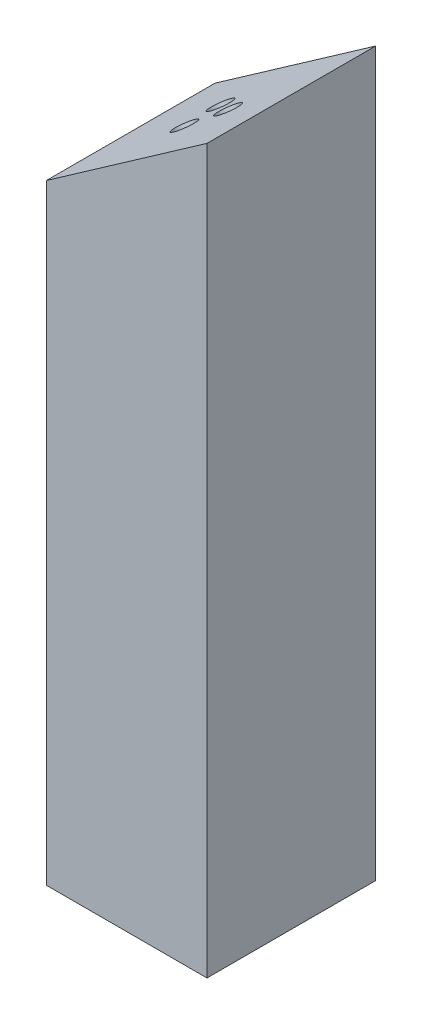
ISO-10303-21;
HEADER;
FILE_DESCRIPTION(('STEP AP214'),'2;1');
FILE_NAME('part.step','',(''),(''),'','','');
FILE_SCHEMA(('AUTOMOTIVE_DESIGN { 1 0 10303 214 1 1 1 1 }'));
ENDSEC;
DATA;
#1=APPLICATION_CONTEXT('core data for automotive mechanical design processes');
#2=APPLICATION_PROTOCOL_DEFINITION('international standard','automotive_design',2000,#1);
#3=PRODUCT_CONTEXT('',#1,'mechanical');
#4=PRODUCT('Part','Part','',(#3));
#5=PRODUCT_RELATED_PRODUCT_CATEGORY('part','',(#4));
#6=PRODUCT_DEFINITION_FORMATION('','',#4);
#7=PRODUCT_DEFINITION_CONTEXT('part definition',#1,'design');
#8=PRODUCT_DEFINITION('design','',#6,#7);
#9=PRODUCT_DEFINITION_SHAPE('','',#8);
#10=(LENGTH_UNIT() NAMED_UNIT(*) SI_UNIT(.MILLI.,.METRE.));
#11=(NAMED_UNIT(*) PLANE_ANGLE_UNIT() SI_UNIT($,.RADIAN.));
#12=(NAMED_UNIT(*) SI_UNIT($,.STERADIAN.) SOLID_ANGLE_UNIT());
#13=UNCERTAINTY_MEASURE_WITH_UNIT(LENGTH_MEASURE(1.E-05),#10,'distance_accuracy_value','');
#14=(GEOMETRIC_REPRESENTATION_CONTEXT(3) GLOBAL_UNCERTAINTY_ASSIGNED_CONTEXT((#13)) GLOBAL_UNIT_ASSIGNED_CONTEXT((#10,
#11,#12)) REPRESENTATION_CONTEXT('',''));
#15=CARTESIAN_POINT('',(0.,0.,0.));
#16=DIRECTION('',(0.,0.,1.));
#17=DIRECTION('',(1.,0.,0.));
#18=AXIS2_PLACEMENT_3D('',#15,#16,#17);
#19=CARTESIAN_POINT('',(-50.,350.,-52.5));
#20=DIRECTION('',(1.,0.,0.));
#21=DIRECTION('',(0.,0.,-1.));
#22=AXIS2_PLACEMENT_3D('',#19,#20,#21);
#23=PLANE('',#22);
#24=CARTESIAN_POINT('',(-50.,361.97924617903,-27.));
#25=DIRECTION('',(1.,0.,0.));
#26=DIRECTION('',(0.,0.,-1.));
#27=AXIS2_PLACEMENT_3D('',#24,#25,#26);
#28=CIRCLE('',#27,8.);
#29=CARTESIAN_POINT('',(-50.,353.97924617903,-27.));
#30=VERTEX_POINT('',#29);
#31=CARTESIAN_POINT('',(-50.,361.97924617903,-35.));
#32=VERTEX_POINT('',#31);
#33=EDGE_CURVE('E59',#30,#32,#28,.T.);
#34=ORIENTED_EDGE('',*,*,#33,.T.);
#35=CARTESIAN_POINT('',(-50.,361.97924617903,-27.));
#36=DIRECTION('',(1.,0.,0.));
#37=DIRECTION('',(0.,0.,-1.));
#38=AXIS2_PLACEMENT_3D('',#35,#36,#37);
#39=CIRCLE('',#38,8.);
#40=CARTESIAN_POINT('',(-50.,369.97924617903,-27.));
#41=VERTEX_POINT('',#40);
#42=EDGE_CURVE('E45',#32,#41,#39,.T.);
#43=ORIENTED_EDGE('',*,*,#42,.T.);
#44=DIRECTION('',(0.,0.,-1.));
#45=VECTOR('',#44,1.);
#46=CARTESIAN_POINT('',(-50.,369.97924617903,-35.));
#47=LINE('',#46,#45);
#48=CARTESIAN_POINT('',(-50.,369.97924617903,27.));
#49=VERTEX_POINT('',#48);
#50=EDGE_CURVE('E251',#49,#41,#47,.T.);
#51=ORIENTED_EDGE('',*,*,#50,.F.);
#52=CARTESIAN_POINT('',(-50.,361.97924617903,27.));
#53=DIRECTION('',(1.,0.,0.));
#54=DIRECTION('',(0.,0.,-1.));
#55=AXIS2_PLACEMENT_3D('',#52,#53,#54);
#56=CIRCLE('',#55,8.);
#57=CARTESIAN_POINT('',(-50.,361.97924617903,35.));
#58=VERTEX_POINT('',#57);
#59=EDGE_CURVE('E226',#49,#58,#56,.T.);
#60=ORIENTED_EDGE('',*,*,#59,.T.);
#61=CARTESIAN_POINT('',(-50.,361.97924617903,27.));
#62=DIRECTION('',(1.,0.,0.));
#63=DIRECTION('',(0.,0.,-1.));
#64=AXIS2_PLACEMENT_3D('',#61,#62,#63);
#65=CIRCLE('',#64,8.);
#66=CARTESIAN_POINT('',(-50.,353.97924617903,27.));
#67=VERTEX_POINT('',#66);
#68=EDGE_CURVE('E222',#58,#67,#65,.T.);
#69=ORIENTED_EDGE('',*,*,#68,.T.);
#70=DIRECTION('',(0.,0.,1.));
#71=VECTOR('',#70,1.);
#72=CARTESIAN_POINT('',(-50.,353.97924617903,-35.));
#73=LINE('',#72,#71);
#74=EDGE_CURVE('E257',#30,#67,#73,.T.);
#75=ORIENTED_EDGE('',*,*,#74,.F.);
#76=EDGE_LOOP('',(#34,#43,#51,#60,#69,#75));
#77=FACE_BOUND('',#76,.T.);
#78=DIRECTION('',(0.,-1.,0.));
#79=VECTOR('',#78,1.);
#80=CARTESIAN_POINT('',(-50.,350.,52.5));
#81=LINE('',#80,#79);
#82=CARTESIAN_POINT('',(-50.,379.97924617903,52.5));
#83=VERTEX_POINT('',#82);
#84=CARTESIAN_POINT('',(-50.,0.,52.5));
#85=VERTEX_POINT('',#84);
#86=EDGE_CURVE('E210',#83,#85,#81,.T.);
#87=ORIENTED_EDGE('',*,*,#86,.F.);
#88=DIRECTION('',(0.,0.,1.));
#89=VECTOR('',#88,1.);
#90=CARTESIAN_POINT('',(-50.,379.97924617903,-52.501));
#91=LINE('',#90,#89);
#92=CARTESIAN_POINT('',(-50.,379.97924617903,-52.5));
#93=VERTEX_POINT('',#92);
#94=EDGE_CURVE('E166',#93,#83,#91,.T.);
#95=ORIENTED_EDGE('',*,*,#94,.F.);
#96=DIRECTION('',(0.,-1.,0.));
#97=VECTOR('',#96,1.);
#98=CARTESIAN_POINT('',(-50.,350.,-52.5));
#99=LINE('',#98,#97);
#100=CARTESIAN_POINT('',(-50.,0.,-52.5));
#101=VERTEX_POINT('',#100);
#102=EDGE_CURVE('E202',#93,#101,#99,.T.);
#103=ORIENTED_EDGE('',*,*,#102,.T.);
#104=DIRECTION('',(0.,0.,1.));
#105=VECTOR('',#104,1.);
#106=CARTESIAN_POINT('',(-50.,0.,-52.5));
#107=LINE('',#106,#105);
#108=EDGE_CURVE('E192',#101,#85,#107,.T.);
#109=ORIENTED_EDGE('',*,*,#108,.T.);
#110=EDGE_LOOP('',(#87,#95,#103,#109));
#111=FACE_BOUND('',#110,.T.);
#112=ADVANCED_FACE('F36',(#77,#111),#23,.F.);
#113=CARTESIAN_POINT('',(-50.,350.,52.5));
#114=DIRECTION('',(0.,0.,-1.));
#115=DIRECTION('',(-1.,0.,0.));
#116=AXIS2_PLACEMENT_3D('',#113,#114,#115);
#117=PLANE('',#116);
#118=DIRECTION('',(0.,-1.,0.));
#119=VECTOR('',#118,1.);
#120=CARTESIAN_POINT('',(50.,350.,52.5));
#121=LINE('',#120,#119);
#122=CARTESIAN_POINT('',(50.,450.,52.5));
#123=VERTEX_POINT('',#122);
#124=CARTESIAN_POINT('',(50.,0.,52.5));
#125=VERTEX_POINT('',#124);
#126=EDGE_CURVE('E207',#123,#125,#121,.T.);
#127=ORIENTED_EDGE('',*,*,#126,.F.);
#128=DIRECTION('',(0.819152044288995,0.573576436351042,0.));
#129=VECTOR('',#128,1.);
#130=CARTESIAN_POINT('',(50.,450.,52.5));
#131=LINE('',#130,#129);
#132=EDGE_CURVE('E163',#83,#123,#131,.T.);
#133=ORIENTED_EDGE('',*,*,#132,.F.);
#134=ORIENTED_EDGE('',*,*,#86,.T.);
#135=DIRECTION('',(1.,0.,0.));
#136=VECTOR('',#135,1.);
#137=CARTESIAN_POINT('',(-50.,0.,52.5));
#138=LINE('',#137,#136);
#139=EDGE_CURVE('E195',#85,#125,#138,.T.);
#140=ORIENTED_EDGE('',*,*,#139,.T.);
#141=EDGE_LOOP('',(#127,#133,#134,#140));
#142=FACE_BOUND('',#141,.T.);
#143=ADVANCED_FACE('F302',(#142),#117,.F.);
#144=CARTESIAN_POINT('',(50.,350.,-52.5));
#145=DIRECTION('',(-1.,0.,0.));
#146=DIRECTION('',(0.,0.,1.));
#147=AXIS2_PLACEMENT_3D('',#144,#145,#146);
#148=PLANE('',#147);
#149=DIRECTION('',(0.,0.,-1.));
#150=VECTOR('',#149,1.);
#151=CARTESIAN_POINT('',(50.,0.,-52.5));
#152=LINE('',#151,#150);
#153=CARTESIAN_POINT('',(50.,0.,-52.5));
#154=VERTEX_POINT('',#153);
#155=EDGE_CURVE('E197',#125,#154,#152,.T.);
#156=ORIENTED_EDGE('',*,*,#155,.T.);
#157=DIRECTION('',(0.,-1.,0.));
#158=VECTOR('',#157,1.);
#159=CARTESIAN_POINT('',(50.,350.,-52.5));
#160=LINE('',#159,#158);
#161=CARTESIAN_POINT('',(50.,450.,-52.5));
#162=VERTEX_POINT('',#161);
#163=EDGE_CURVE('E204',#162,#154,#160,.T.);
#164=ORIENTED_EDGE('',*,*,#163,.F.);
#165=DIRECTION('',(0.,0.,-1.));
#166=VECTOR('',#165,1.);
#167=CARTESIAN_POINT('',(50.,450.,-52.5));
#168=LINE('',#167,#166);
#169=EDGE_CURVE('E190',#123,#162,#168,.T.);
#170=ORIENTED_EDGE('',*,*,#169,.F.);
#171=ORIENTED_EDGE('',*,*,#126,.T.);
#172=EDGE_LOOP('',(#156,#164,#170,#171));
#173=FACE_BOUND('',#172,.T.);
#174=ADVANCED_FACE('F304',(#173),#148,.F.);
#175=CARTESIAN_POINT('',(-50.,350.,-52.5));
#176=DIRECTION('',(0.,0.,1.));
#177=DIRECTION('',(1.,0.,0.));
#178=AXIS2_PLACEMENT_3D('',#175,#176,#177);
#179=PLANE('',#178);
#180=ORIENTED_EDGE('',*,*,#102,.F.);
#181=DIRECTION('',(-0.819152044288995,-0.573576436351042,0.));
#182=VECTOR('',#181,1.);
#183=CARTESIAN_POINT('',(50.,450.,-52.5));
#184=LINE('',#183,#182);
#185=EDGE_CURVE('E188',#162,#93,#184,.T.);
#186=ORIENTED_EDGE('',*,*,#185,.F.);
#187=ORIENTED_EDGE('',*,*,#163,.T.);
#188=DIRECTION('',(-1.,0.,0.));
#189=VECTOR('',#188,1.);
#190=CARTESIAN_POINT('',(-50.,0.,-52.5));
#191=LINE('',#190,#189);
#192=EDGE_CURVE('E199',#154,#101,#191,.T.);
#193=ORIENTED_EDGE('',*,*,#192,.T.);
#194=EDGE_LOOP('',(#180,#186,#187,#193));
#195=FACE_BOUND('',#194,.T.);
#196=ADVANCED_FACE('F294',(#195),#179,.F.);
#197=CARTESIAN_POINT('',(0.,0.,0.));
#198=DIRECTION('',(0.,1.,0.));
#199=DIRECTION('',(0.,0.,1.));
#200=AXIS2_PLACEMENT_3D('',#197,#198,#199);
#201=PLANE('',#200);
#202=DIRECTION('',(-1.,0.,0.));
#203=VECTOR('',#202,1.);
#204=CARTESIAN_POINT('',(-50.,0.,-47.5));
#205=LINE('',#204,#203);
#206=CARTESIAN_POINT('',(45.,0.,-47.5));
#207=VERTEX_POINT('',#206);
#208=CARTESIAN_POINT('',(-45.,0.,-47.5));
#209=VERTEX_POINT('',#208);
#210=EDGE_CURVE('E174',#207,#209,#205,.T.);
#211=ORIENTED_EDGE('',*,*,#210,.T.);
#212=DIRECTION('',(0.,0.,1.));
#213=VECTOR('',#212,1.);
#214=CARTESIAN_POINT('',(-45.,0.,-52.5));
#215=LINE('',#214,#213);
#216=CARTESIAN_POINT('',(-45.,0.,47.5));
#217=VERTEX_POINT('',#216);
#218=EDGE_CURVE('E178',#209,#217,#215,.T.);
#219=ORIENTED_EDGE('',*,*,#218,.T.);
#220=DIRECTION('',(1.,0.,0.));
#221=VECTOR('',#220,1.);
#222=CARTESIAN_POINT('',(-50.,0.,47.5));
#223=LINE('',#222,#221);
#224=CARTESIAN_POINT('',(45.,0.,47.5));
#225=VERTEX_POINT('',#224);
#226=EDGE_CURVE('E161',#217,#225,#223,.T.);
#227=ORIENTED_EDGE('',*,*,#226,.T.);
#228=DIRECTION('',(0.,0.,-1.));
#229=VECTOR('',#228,1.);
#230=CARTESIAN_POINT('',(45.,0.,-52.5));
#231=LINE('',#230,#229);
#232=EDGE_CURVE('E183',#225,#207,#231,.T.);
#233=ORIENTED_EDGE('',*,*,#232,.T.);
#234=EDGE_LOOP('',(#211,#219,#227,#233));
#235=FACE_BOUND('',#234,.T.);
#236=ORIENTED_EDGE('',*,*,#108,.F.);
#237=ORIENTED_EDGE('',*,*,#192,.F.);
#238=ORIENTED_EDGE('',*,*,#155,.F.);
#239=ORIENTED_EDGE('',*,*,#139,.F.);
#240=EDGE_LOOP('',(#236,#237,#238,#239));
#241=FACE_BOUND('',#240,.T.);
#242=ADVANCED_FACE('F283',(#235,#241),#201,.F.);
#243=CARTESIAN_POINT('',(50.,450.,-52.501));
#244=DIRECTION('',(0.573576436351042,-0.819152044288995,0.));
#245=DIRECTION('',(0.819152044288995,0.573576436351042,0.));
#246=AXIS2_PLACEMENT_3D('',#243,#244,#245);
#247=PLANE('',#246);
#248=CARTESIAN_POINT('',(10.6489765757568,422.446116762079,0.));
#249=DIRECTION('',(-0.573576436351042,0.819152044288995,0.));
#250=DIRECTION('',(-0.819152044288995,-0.573576436351042,0.));
#251=AXIS2_PLACEMENT_3D('',#248,#249,#250);
#252=CIRCLE('',#251,6.99999999999998);
#253=CARTESIAN_POINT('',(4.91491226573386,418.431081707621,0.));
#254=VERTEX_POINT('',#253);
#255=EDGE_CURVE('E157',#254,#254,#252,.T.);
#256=ORIENTED_EDGE('',*,*,#255,.F.);
#257=EDGE_LOOP('',(#256));
#258=FACE_BOUND('',#257,.T.);
#259=CARTESIAN_POINT('',(-5.32448828787857,411.261376253233,11.2583302491977));
#260=DIRECTION('',(-0.573576436351042,0.819152044288995,0.));
#261=DIRECTION('',(-0.819152044288995,-0.573576436351042,0.));
#262=AXIS2_PLACEMENT_3D('',#259,#260,#261);
#263=CIRCLE('',#262,7.00000000000003);
#264=CARTESIAN_POINT('',(-11.0585525979016,407.246341198776,11.2583302491977));
#265=VERTEX_POINT('',#264);
#266=EDGE_CURVE('E270',#265,#265,#263,.T.);
#267=ORIENTED_EDGE('',*,*,#266,.F.);
#268=EDGE_LOOP('',(#267));
#269=FACE_BOUND('',#268,.T.);
#270=CARTESIAN_POINT('',(-5.32448828787857,411.261376253233,-11.2583302491977));
#271=DIRECTION('',(-0.573576436351042,0.819152044288995,0.));
#272=DIRECTION('',(-0.819152044288995,-0.573576436351042,0.));
#273=AXIS2_PLACEMENT_3D('',#270,#271,#272);
#274=CIRCLE('',#273,7.00000000000003);
#275=CARTESIAN_POINT('',(-11.0585525979016,407.246341198776,-11.2583302491977));
#276=VERTEX_POINT('',#275);
#277=EDGE_CURVE('E260',#276,#276,#274,.T.);
#278=ORIENTED_EDGE('',*,*,#277,.F.);
#279=EDGE_LOOP('',(#278));
#280=FACE_BOUND('',#279,.T.);
#281=ORIENTED_EDGE('',*,*,#185,.T.);
#282=ORIENTED_EDGE('',*,*,#94,.T.);
#283=ORIENTED_EDGE('',*,*,#132,.T.);
#284=ORIENTED_EDGE('',*,*,#169,.T.);
#285=EDGE_LOOP('',(#281,#282,#283,#284));
#286=FACE_BOUND('',#285,.T.);
#287=ADVANCED_FACE('F280',(#258,#269,#280,#286),#247,.F.);
#288=CARTESIAN_POINT('',(-45.,350.,-52.5));
#289=DIRECTION('',(1.,0.,0.));
#290=DIRECTION('',(0.,0.,-1.));
#291=AXIS2_PLACEMENT_3D('',#288,#289,#290);
#292=PLANE('',#291);
#293=DIRECTION('',(0.,0.,-1.));
#294=VECTOR('',#293,1.);
#295=CARTESIAN_POINT('',(-45.,369.97924617903,-35.));
#296=LINE('',#295,#294);
#297=CARTESIAN_POINT('',(-45.,369.97924617903,27.));
#298=VERTEX_POINT('',#297);
#299=CARTESIAN_POINT('',(-45.,369.97924617903,-27.));
#300=VERTEX_POINT('',#299);
#301=EDGE_CURVE('E235',#298,#300,#296,.T.);
#302=ORIENTED_EDGE('',*,*,#301,.T.);
#303=CARTESIAN_POINT('',(-45.,361.97924617903,-27.));
#304=DIRECTION('',(1.,0.,0.));
#305=DIRECTION('',(0.,0.,-1.));
#306=AXIS2_PLACEMENT_3D('',#303,#304,#305);
#307=CIRCLE('',#306,8.);
#308=CARTESIAN_POINT('',(-45.,361.97924617903,-35.));
#309=VERTEX_POINT('',#308);
#310=EDGE_CURVE('E11',#300,#309,#307,.F.);
#311=ORIENTED_EDGE('',*,*,#310,.T.);
#312=CARTESIAN_POINT('',(-45.,361.97924617903,-27.));
#313=DIRECTION('',(1.,0.,0.));
#314=DIRECTION('',(0.,0.,-1.));
#315=AXIS2_PLACEMENT_3D('',#312,#313,#314);
#316=CIRCLE('',#315,8.);
#317=CARTESIAN_POINT('',(-45.,353.97924617903,-27.));
#318=VERTEX_POINT('',#317);
#319=EDGE_CURVE('E231',#309,#318,#316,.F.);
#320=ORIENTED_EDGE('',*,*,#319,.T.);
#321=DIRECTION('',(0.,0.,1.));
#322=VECTOR('',#321,1.);
#323=CARTESIAN_POINT('',(-45.,353.97924617903,-35.));
#324=LINE('',#323,#322);
#325=CARTESIAN_POINT('',(-45.,353.97924617903,27.));
#326=VERTEX_POINT('',#325);
#327=EDGE_CURVE('E239',#318,#326,#324,.T.);
#328=ORIENTED_EDGE('',*,*,#327,.T.);
#329=CARTESIAN_POINT('',(-45.,361.97924617903,27.));
#330=DIRECTION('',(1.,0.,0.));
#331=DIRECTION('',(0.,0.,-1.));
#332=AXIS2_PLACEMENT_3D('',#329,#330,#331);
#333=CIRCLE('',#332,8.);
#334=CARTESIAN_POINT('',(-45.,361.97924617903,35.));
#335=VERTEX_POINT('',#334);
#336=EDGE_CURVE('E224',#326,#335,#333,.F.);
#337=ORIENTED_EDGE('',*,*,#336,.T.);
#338=CARTESIAN_POINT('',(-45.,361.97924617903,27.));
#339=DIRECTION('',(1.,0.,0.));
#340=DIRECTION('',(0.,0.,-1.));
#341=AXIS2_PLACEMENT_3D('',#338,#339,#340);
#342=CIRCLE('',#341,8.);
#343=EDGE_CURVE('E228',#335,#298,#342,.F.);
#344=ORIENTED_EDGE('',*,*,#343,.T.);
#345=EDGE_LOOP('',(#302,#311,#320,#328,#337,#344));
#346=FACE_BOUND('',#345,.T.);
#347=DIRECTION('',(0.,-1.,0.));
#348=VECTOR('',#347,1.);
#349=CARTESIAN_POINT('',(-45.,350.,47.5));
#350=LINE('',#349,#348);
#351=CARTESIAN_POINT('',(-45.,377.376410926271,47.5));
#352=VERTEX_POINT('',#351);
#353=EDGE_CURVE('E143',#352,#217,#350,.T.);
#354=ORIENTED_EDGE('',*,*,#353,.T.);
#355=ORIENTED_EDGE('',*,*,#218,.F.);
#356=DIRECTION('',(0.,-1.,0.));
#357=VECTOR('',#356,1.);
#358=CARTESIAN_POINT('',(-45.,350.,-47.5));
#359=LINE('',#358,#357);
#360=CARTESIAN_POINT('',(-45.,377.376410926271,-47.5));
#361=VERTEX_POINT('',#360);
#362=EDGE_CURVE('E145',#361,#209,#359,.T.);
#363=ORIENTED_EDGE('',*,*,#362,.F.);
#364=DIRECTION('',(0.,0.,1.));
#365=VECTOR('',#364,1.);
#366=CARTESIAN_POINT('',(-45.,377.376410926271,-52.501));
#367=LINE('',#366,#365);
#368=EDGE_CURVE('E138',#361,#352,#367,.T.);
#369=ORIENTED_EDGE('',*,*,#368,.T.);
#370=EDGE_LOOP('',(#354,#355,#363,#369));
#371=FACE_BOUND('',#370,.T.);
#372=ADVANCED_FACE('F140',(#346,#371),#292,.T.);
#373=CARTESIAN_POINT('',(-50.,350.,47.5));
#374=DIRECTION('',(0.,0.,-1.));
#375=DIRECTION('',(-1.,0.,0.));
#376=AXIS2_PLACEMENT_3D('',#373,#374,#375);
#377=PLANE('',#376);
#378=DIRECTION('',(0.,-1.,0.));
#379=VECTOR('',#378,1.);
#380=CARTESIAN_POINT('',(45.,350.,47.5));
#381=LINE('',#380,#379);
#382=CARTESIAN_POINT('',(45.,440.395089365144,47.5));
#383=VERTEX_POINT('',#382);
#384=EDGE_CURVE('E164',#383,#225,#381,.T.);
#385=ORIENTED_EDGE('',*,*,#384,.T.);
#386=ORIENTED_EDGE('',*,*,#226,.F.);
#387=ORIENTED_EDGE('',*,*,#353,.F.);
#388=DIRECTION('',(0.819152044288995,0.573576436351042,0.));
#389=VECTOR('',#388,1.);
#390=CARTESIAN_POINT('',(52.8678821817552,445.904239778555,47.5));
#391=LINE('',#390,#389);
#392=EDGE_CURVE('E149',#352,#383,#391,.T.);
#393=ORIENTED_EDGE('',*,*,#392,.T.);
#394=EDGE_LOOP('',(#385,#386,#387,#393));
#395=FACE_BOUND('',#394,.T.);
#396=ADVANCED_FACE('F159',(#395),#377,.T.);
#397=CARTESIAN_POINT('',(45.,350.,-52.5));
#398=DIRECTION('',(-1.,0.,0.));
#399=DIRECTION('',(0.,0.,1.));
#400=AXIS2_PLACEMENT_3D('',#397,#398,#399);
#401=PLANE('',#400);
#402=ORIENTED_EDGE('',*,*,#232,.F.);
#403=ORIENTED_EDGE('',*,*,#384,.F.);
#404=DIRECTION('',(0.,0.,-1.));
#405=VECTOR('',#404,1.);
#406=CARTESIAN_POINT('',(45.,440.395089365144,-52.501));
#407=LINE('',#406,#405);
#408=CARTESIAN_POINT('',(45.,440.395089365144,-47.5));
#409=VERTEX_POINT('',#408);
#410=EDGE_CURVE('E153',#383,#409,#407,.T.);
#411=ORIENTED_EDGE('',*,*,#410,.T.);
#412=DIRECTION('',(0.,-1.,0.));
#413=VECTOR('',#412,1.);
#414=CARTESIAN_POINT('',(45.,350.,-47.5));
#415=LINE('',#414,#413);
#416=EDGE_CURVE('E168',#409,#207,#415,.T.);
#417=ORIENTED_EDGE('',*,*,#416,.T.);
#418=EDGE_LOOP('',(#402,#403,#411,#417));
#419=FACE_BOUND('',#418,.T.);
#420=ADVANCED_FACE('F391',(#419),#401,.T.);
#421=CARTESIAN_POINT('',(-50.,350.,-47.5));
#422=DIRECTION('',(0.,0.,1.));
#423=DIRECTION('',(1.,0.,0.));
#424=AXIS2_PLACEMENT_3D('',#421,#422,#423);
#425=PLANE('',#424);
#426=ORIENTED_EDGE('',*,*,#362,.T.);
#427=ORIENTED_EDGE('',*,*,#210,.F.);
#428=ORIENTED_EDGE('',*,*,#416,.F.);
#429=DIRECTION('',(-0.819152044288995,-0.573576436351042,0.));
#430=VECTOR('',#429,1.);
#431=CARTESIAN_POINT('',(52.8678821817552,445.904239778555,-47.5));
#432=LINE('',#431,#430);
#433=EDGE_CURVE('E148',#409,#361,#432,.T.);
#434=ORIENTED_EDGE('',*,*,#433,.T.);
#435=EDGE_LOOP('',(#426,#427,#428,#434));
#436=FACE_BOUND('',#435,.T.);
#437=ADVANCED_FACE('F382',(#436),#425,.T.);
#438=CARTESIAN_POINT('',(52.8678821817552,445.904239778555,-52.501));
#439=DIRECTION('',(0.573576436351042,-0.819152044288995,0.));
#440=DIRECTION('',(0.819152044288995,0.573576436351042,0.));
#441=AXIS2_PLACEMENT_3D('',#438,#439,#440);
#442=PLANE('',#441);
#443=CARTESIAN_POINT('',(13.5168587575122,418.350356540633,0.));
#444=DIRECTION('',(0.573576436351042,-0.819152044288995,0.));
#445=DIRECTION('',(0.819152044288995,0.573576436351042,0.));
#446=AXIS2_PLACEMENT_3D('',#443,#444,#445);
#447=CIRCLE('',#446,6.99999999999998);
#448=CARTESIAN_POINT('',(19.2509230675351,422.365391595091,0.));
#449=VERTEX_POINT('',#448);
#450=EDGE_CURVE('E267',#449,#449,#447,.F.);
#451=ORIENTED_EDGE('',*,*,#450,.T.);
#452=EDGE_LOOP('',(#451));
#453=FACE_BOUND('',#452,.T.);
#454=CARTESIAN_POINT('',(-2.45660610612322,407.165616031788,11.2583302491977));
#455=DIRECTION('',(0.573576436351042,-0.819152044288995,0.));
#456=DIRECTION('',(0.819152044288995,0.573576436351042,0.));
#457=AXIS2_PLACEMENT_3D('',#454,#455,#456);
#458=CIRCLE('',#457,7.00000000000003);
#459=CARTESIAN_POINT('',(3.27745820389977,411.180651086245,11.2583302491977));
#460=VERTEX_POINT('',#459);
#461=EDGE_CURVE('E273',#460,#460,#458,.F.);
#462=ORIENTED_EDGE('',*,*,#461,.T.);
#463=EDGE_LOOP('',(#462));
#464=FACE_BOUND('',#463,.T.);
#465=CARTESIAN_POINT('',(-2.45660610612322,407.165616031788,-11.2583302491977));
#466=DIRECTION('',(0.573576436351042,-0.819152044288995,0.));
#467=DIRECTION('',(0.819152044288995,0.573576436351042,0.));
#468=AXIS2_PLACEMENT_3D('',#465,#466,#467);
#469=CIRCLE('',#468,7.00000000000003);
#470=CARTESIAN_POINT('',(3.27745820389977,411.180651086245,-11.2583302491977));
#471=VERTEX_POINT('',#470);
#472=EDGE_CURVE('E171',#471,#471,#469,.F.);
#473=ORIENTED_EDGE('',*,*,#472,.T.);
#474=EDGE_LOOP('',(#473));
#475=FACE_BOUND('',#474,.T.);
#476=ORIENTED_EDGE('',*,*,#433,.F.);
#477=ORIENTED_EDGE('',*,*,#410,.F.);
#478=ORIENTED_EDGE('',*,*,#392,.F.);
#479=ORIENTED_EDGE('',*,*,#368,.F.);
#480=EDGE_LOOP('',(#476,#477,#478,#479));
#481=FACE_BOUND('',#480,.T.);
#482=ADVANCED_FACE('F152',(#453,#464,#475,#481),#442,.T.);
#483=CARTESIAN_POINT('',(206.107150225189,109.305703148573,-11.2583302491977));
#484=DIRECTION('',(-0.573576436351042,0.819152044288995,0.));
#485=DIRECTION('',(-0.819152044288995,-0.573576436351042,0.));
#486=AXIS2_PLACEMENT_3D('',#483,#484,#485);
#487=CYLINDRICAL_SURFACE('',#486,7.00000000000003);
#488=ORIENTED_EDGE('',*,*,#472,.F.);
#489=EDGE_LOOP('',(#488));
#490=FACE_BOUND('',#489,.T.);
#491=ORIENTED_EDGE('',*,*,#277,.T.);
#492=EDGE_LOOP('',(#491));
#493=FACE_BOUND('',#492,.T.);
#494=ADVANCED_FACE('F278',(#490,#493),#487,.F.);
#495=CARTESIAN_POINT('',(206.107150225189,109.305703148573,11.2583302491977));
#496=DIRECTION('',(-0.573576436351042,0.819152044288995,0.));
#497=DIRECTION('',(-0.819152044288995,-0.573576436351042,0.));
#498=AXIS2_PLACEMENT_3D('',#495,#496,#497);
#499=CYLINDRICAL_SURFACE('',#498,7.00000000000003);
#500=ORIENTED_EDGE('',*,*,#461,.F.);
#501=EDGE_LOOP('',(#500));
#502=FACE_BOUND('',#501,.T.);
#503=ORIENTED_EDGE('',*,*,#266,.T.);
#504=EDGE_LOOP('',(#503));
#505=FACE_BOUND('',#504,.T.);
#506=ADVANCED_FACE('F360',(#502,#505),#499,.F.);
#507=CARTESIAN_POINT('',(222.080615088824,120.490443657419,0.));
#508=DIRECTION('',(-0.573576436351042,0.819152044288995,0.));
#509=DIRECTION('',(-0.819152044288995,-0.573576436351042,0.));
#510=AXIS2_PLACEMENT_3D('',#507,#508,#509);
#511=CYLINDRICAL_SURFACE('',#510,6.99999999999998);
#512=ORIENTED_EDGE('',*,*,#450,.F.);
#513=EDGE_LOOP('',(#512));
#514=FACE_BOUND('',#513,.T.);
#515=ORIENTED_EDGE('',*,*,#255,.T.);
#516=EDGE_LOOP('',(#515));
#517=FACE_BOUND('',#516,.T.);
#518=ADVANCED_FACE('F352',(#514,#517),#511,.F.);
#519=CARTESIAN_POINT('',(50.001,369.97924617903,-35.));
#520=DIRECTION('',(0.,1.,0.));
#521=DIRECTION('',(0.,0.,1.));
#522=AXIS2_PLACEMENT_3D('',#519,#520,#521);
#523=PLANE('',#522);
#524=ORIENTED_EDGE('',*,*,#301,.F.);
#525=DIRECTION('',(-1.,0.,0.));
#526=VECTOR('',#525,1.);
#527=CARTESIAN_POINT('',(-50.,369.97924617903,27.));
#528=LINE('',#527,#526);
#529=EDGE_CURVE('E220',#298,#49,#528,.T.);
#530=ORIENTED_EDGE('',*,*,#529,.T.);
#531=ORIENTED_EDGE('',*,*,#50,.T.);
#532=DIRECTION('',(-1.,0.,0.));
#533=VECTOR('',#532,1.);
#534=CARTESIAN_POINT('',(-45.,369.97924617903,-27.));
#535=LINE('',#534,#533);
#536=EDGE_CURVE('E218',#41,#300,#535,.F.);
#537=ORIENTED_EDGE('',*,*,#536,.T.);
#538=EDGE_LOOP('',(#524,#530,#531,#537));
#539=FACE_BOUND('',#538,.T.);
#540=ADVANCED_FACE('F255',(#539),#523,.F.);
#541=CARTESIAN_POINT('',(50.001,353.97924617903,-35.));
#542=DIRECTION('',(0.,-1.,0.));
#543=DIRECTION('',(0.,0.,-1.));
#544=AXIS2_PLACEMENT_3D('',#541,#542,#543);
#545=PLANE('',#544);
#546=ORIENTED_EDGE('',*,*,#74,.T.);
#547=DIRECTION('',(-1.,0.,0.));
#548=VECTOR('',#547,1.);
#549=CARTESIAN_POINT('',(-45.,353.97924617903,27.));
#550=LINE('',#549,#548);
#551=EDGE_CURVE('E215',#67,#326,#550,.F.);
#552=ORIENTED_EDGE('',*,*,#551,.T.);
#553=ORIENTED_EDGE('',*,*,#327,.F.);
#554=DIRECTION('',(-1.,0.,0.));
#555=VECTOR('',#554,1.);
#556=CARTESIAN_POINT('',(-50.,353.97924617903,-27.));
#557=LINE('',#556,#555);
#558=EDGE_CURVE('E212',#318,#30,#557,.T.);
#559=ORIENTED_EDGE('',*,*,#558,.T.);
#560=EDGE_LOOP('',(#546,#552,#553,#559));
#561=FACE_BOUND('',#560,.T.);
#562=ADVANCED_FACE('F323',(#561),#545,.F.);
#563=CARTESIAN_POINT('',(50.001,361.97924617903,27.));
#564=DIRECTION('',(1.,0.,0.));
#565=DIRECTION('',(0.,0.,-1.));
#566=AXIS2_PLACEMENT_3D('',#563,#564,#565);
#567=CYLINDRICAL_SURFACE('',#566,8.);
#568=ORIENTED_EDGE('',*,*,#529,.F.);
#569=ORIENTED_EDGE('',*,*,#343,.F.);
#570=DIRECTION('',(-1.,0.,0.));
#571=VECTOR('',#570,1.);
#572=CARTESIAN_POINT('',(-45.,361.97924617903,35.));
#573=LINE('',#572,#571);
#574=EDGE_CURVE('E233',#58,#335,#573,.F.);
#575=ORIENTED_EDGE('',*,*,#574,.F.);
#576=ORIENTED_EDGE('',*,*,#59,.F.);
#577=EDGE_LOOP('',(#568,#569,#575,#576));
#578=FACE_BOUND('',#577,.T.);
#579=ADVANCED_FACE('F321',(#578),#567,.F.);
#580=CARTESIAN_POINT('',(50.001,361.97924617903,27.));
#581=DIRECTION('',(1.,0.,0.));
#582=DIRECTION('',(0.,0.,-1.));
#583=AXIS2_PLACEMENT_3D('',#580,#581,#582);
#584=CYLINDRICAL_SURFACE('',#583,8.);
#585=ORIENTED_EDGE('',*,*,#336,.F.);
#586=ORIENTED_EDGE('',*,*,#551,.F.);
#587=ORIENTED_EDGE('',*,*,#68,.F.);
#588=ORIENTED_EDGE('',*,*,#574,.T.);
#589=EDGE_LOOP('',(#585,#586,#587,#588));
#590=FACE_BOUND('',#589,.T.);
#591=ADVANCED_FACE('F318',(#590),#584,.F.);
#592=CARTESIAN_POINT('',(50.001,361.97924617903,-27.));
#593=DIRECTION('',(1.,0.,0.));
#594=DIRECTION('',(0.,0.,-1.));
#595=AXIS2_PLACEMENT_3D('',#592,#593,#594);
#596=CYLINDRICAL_SURFACE('',#595,8.);
#597=DIRECTION('',(-1.,0.,0.));
#598=VECTOR('',#597,1.);
#599=CARTESIAN_POINT('',(-50.,361.97924617903,-35.));
#600=LINE('',#599,#598);
#601=EDGE_CURVE('E40',#309,#32,#600,.T.);
#602=ORIENTED_EDGE('',*,*,#601,.F.);
#603=ORIENTED_EDGE('',*,*,#310,.F.);
#604=ORIENTED_EDGE('',*,*,#536,.F.);
#605=ORIENTED_EDGE('',*,*,#42,.F.);
#606=EDGE_LOOP('',(#602,#603,#604,#605));
#607=FACE_BOUND('',#606,.T.);
#608=ADVANCED_FACE('F38',(#607),#596,.F.);
#609=CARTESIAN_POINT('',(50.001,361.97924617903,-27.));
#610=DIRECTION('',(1.,0.,0.));
#611=DIRECTION('',(0.,0.,-1.));
#612=AXIS2_PLACEMENT_3D('',#609,#610,#611);
#613=CYLINDRICAL_SURFACE('',#612,8.);
#614=ORIENTED_EDGE('',*,*,#319,.F.);
#615=ORIENTED_EDGE('',*,*,#601,.T.);
#616=ORIENTED_EDGE('',*,*,#33,.F.);
#617=ORIENTED_EDGE('',*,*,#558,.F.);
#618=EDGE_LOOP('',(#614,#615,#616,#617));
#619=FACE_BOUND('',#618,.T.);
#620=ADVANCED_FACE('F244',(#619),#613,.F.);
#621=CLOSED_SHELL('',(#112,#143,#174,#196,#242,#287,#372,#396,#420,#437,#482,#494,#506,#518,
#540,#562,#579,#591,#608,#620));
#622=MANIFOLD_SOLID_BREP('B2',#621);
#623=ADVANCED_BREP_SHAPE_REPRESENTATION('',(#18,#622),#14);
#624=SHAPE_DEFINITION_REPRESENTATION(#9,#623);
ENDSEC;
END-ISO-10303-21;
